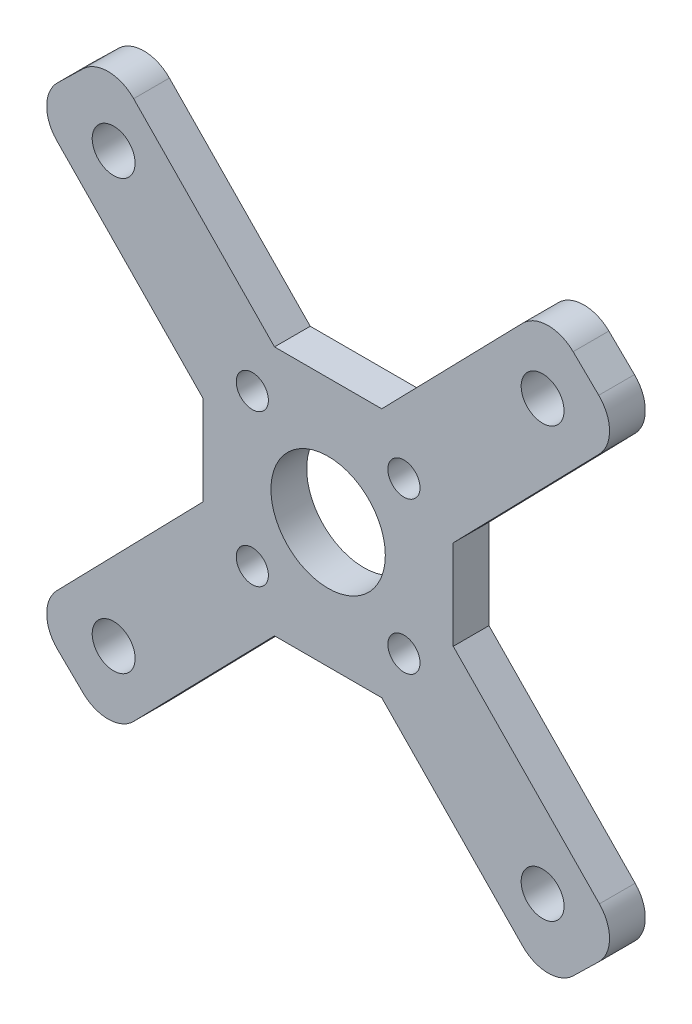
ISO-10303-21;
HEADER;
FILE_DESCRIPTION(('STEP AP214'),'2;1');
FILE_NAME('part.step','',(''),(''),'','','');
FILE_SCHEMA(('AUTOMOTIVE_DESIGN { 1 0 10303 214 1 1 1 1 }'));
ENDSEC;
DATA;
#1=APPLICATION_CONTEXT('core data for automotive mechanical design processes');
#2=APPLICATION_PROTOCOL_DEFINITION('international standard','automotive_design',2000,#1);
#3=PRODUCT_CONTEXT('',#1,'mechanical');
#4=PRODUCT('Part','Part','',(#3));
#5=PRODUCT_RELATED_PRODUCT_CATEGORY('part','',(#4));
#6=PRODUCT_DEFINITION_FORMATION('','',#4);
#7=PRODUCT_DEFINITION_CONTEXT('part definition',#1,'design');
#8=PRODUCT_DEFINITION('design','',#6,#7);
#9=PRODUCT_DEFINITION_SHAPE('','',#8);
#10=(LENGTH_UNIT() NAMED_UNIT(*) SI_UNIT(.MILLI.,.METRE.));
#11=(NAMED_UNIT(*) PLANE_ANGLE_UNIT() SI_UNIT($,.RADIAN.));
#12=(NAMED_UNIT(*) SI_UNIT($,.STERADIAN.) SOLID_ANGLE_UNIT());
#13=UNCERTAINTY_MEASURE_WITH_UNIT(LENGTH_MEASURE(1.E-05),#10,'distance_accuracy_value','');
#14=(GEOMETRIC_REPRESENTATION_CONTEXT(3) GLOBAL_UNCERTAINTY_ASSIGNED_CONTEXT((#13)) GLOBAL_UNIT_ASSIGNED_CONTEXT((#10,
#11,#12)) REPRESENTATION_CONTEXT('',''));
#15=CARTESIAN_POINT('',(0.,0.,0.));
#16=DIRECTION('',(0.,0.,1.));
#17=DIRECTION('',(1.,0.,0.));
#18=AXIS2_PLACEMENT_3D('',#15,#16,#17);
#19=CARTESIAN_POINT('',(17.5,-7.49999999999993,5.));
#20=DIRECTION('',(-1.,0.,0.));
#21=DIRECTION('',(0.,0.,1.));
#22=AXIS2_PLACEMENT_3D('',#19,#20,#21);
#23=PLANE('',#22);
#24=DIRECTION('',(0.,0.,1.));
#25=VECTOR('',#24,1.);
#26=CARTESIAN_POINT('',(17.5,-6.26916795088131,0.));
#27=LINE('',#26,#25);
#28=CARTESIAN_POINT('',(17.5,-6.26916795088131,0.));
#29=VERTEX_POINT('',#28);
#30=CARTESIAN_POINT('',(17.5,-6.26916795088131,5.));
#31=VERTEX_POINT('',#30);
#32=EDGE_CURVE('E329',#29,#31,#27,.T.);
#33=ORIENTED_EDGE('',*,*,#32,.F.);
#34=DIRECTION('',(0.,1.,0.));
#35=VECTOR('',#34,1.);
#36=CARTESIAN_POINT('',(17.5,-7.49999999999993,0.));
#37=LINE('',#36,#35);
#38=CARTESIAN_POINT('',(17.5,6.26916795088131,0.));
#39=VERTEX_POINT('',#38);
#40=EDGE_CURVE('E514',#29,#39,#37,.T.);
#41=ORIENTED_EDGE('',*,*,#40,.T.);
#42=DIRECTION('',(0.,0.,1.));
#43=VECTOR('',#42,1.);
#44=CARTESIAN_POINT('',(17.5,6.26916795088131,0.));
#45=LINE('',#44,#43);
#46=CARTESIAN_POINT('',(17.5,6.26916795088131,5.));
#47=VERTEX_POINT('',#46);
#48=EDGE_CURVE('E388',#39,#47,#45,.T.);
#49=ORIENTED_EDGE('',*,*,#48,.T.);
#50=DIRECTION('',(0.,1.,0.));
#51=VECTOR('',#50,1.);
#52=CARTESIAN_POINT('',(17.5,-7.49999999999993,5.));
#53=LINE('',#52,#51);
#54=EDGE_CURVE('E499',#31,#47,#53,.T.);
#55=ORIENTED_EDGE('',*,*,#54,.F.);
#56=EDGE_LOOP('',(#33,#41,#49,#55));
#57=FACE_BOUND('',#56,.T.);
#58=ADVANCED_FACE('F39',(#57),#23,.F.);
#59=CARTESIAN_POINT('',(-17.5,-7.49999999999994,5.));
#60=DIRECTION('',(1.,0.,0.));
#61=DIRECTION('',(0.,0.,-1.));
#62=AXIS2_PLACEMENT_3D('',#59,#60,#61);
#63=PLANE('',#62);
#64=DIRECTION('',(0.,-1.,0.));
#65=VECTOR('',#64,1.);
#66=CARTESIAN_POINT('',(-17.5,-7.49999999999994,0.));
#67=LINE('',#66,#65);
#68=CARTESIAN_POINT('',(-17.5,6.26916795088131,0.));
#69=VERTEX_POINT('',#68);
#70=CARTESIAN_POINT('',(-17.5,-6.26916795088133,0.));
#71=VERTEX_POINT('',#70);
#72=EDGE_CURVE('E500',#69,#71,#67,.T.);
#73=ORIENTED_EDGE('',*,*,#72,.T.);
#74=DIRECTION('',(0.,0.,1.));
#75=VECTOR('',#74,1.);
#76=CARTESIAN_POINT('',(-17.5,-6.26916795088133,0.));
#77=LINE('',#76,#75);
#78=CARTESIAN_POINT('',(-17.5,-6.26916795088133,5.));
#79=VERTEX_POINT('',#78);
#80=EDGE_CURVE('E270',#71,#79,#77,.T.);
#81=ORIENTED_EDGE('',*,*,#80,.T.);
#82=DIRECTION('',(0.,-1.,0.));
#83=VECTOR('',#82,1.);
#84=CARTESIAN_POINT('',(-17.5,-7.49999999999994,5.));
#85=LINE('',#84,#83);
#86=CARTESIAN_POINT('',(-17.5,6.26916795088131,5.));
#87=VERTEX_POINT('',#86);
#88=EDGE_CURVE('E507',#87,#79,#85,.T.);
#89=ORIENTED_EDGE('',*,*,#88,.F.);
#90=DIRECTION('',(0.,0.,1.));
#91=VECTOR('',#90,1.);
#92=CARTESIAN_POINT('',(-17.5,6.26916795088131,0.));
#93=LINE('',#92,#91);
#94=EDGE_CURVE('E449',#69,#87,#93,.T.);
#95=ORIENTED_EDGE('',*,*,#94,.F.);
#96=EDGE_LOOP('',(#73,#81,#89,#95));
#97=FACE_BOUND('',#96,.T.);
#98=ADVANCED_FACE('F564',(#97),#63,.F.);
#99=CARTESIAN_POINT('',(-7.50000000000001,-7.50000000000001,5.));
#100=DIRECTION('',(0.,0.,-1.));
#101=DIRECTION('',(-1.,0.,0.));
#102=AXIS2_PLACEMENT_3D('',#99,#100,#101);
#103=PLANE('',#102);
#104=ORIENTED_EDGE('',*,*,#88,.T.);
#105=DIRECTION('',(-0.697933742188362,-0.716162336006963,0.));
#106=VECTOR('',#105,1.);
#107=CARTESIAN_POINT('',(-5.84200619075185,5.69330867821478,5.));
#108=LINE('',#107,#106);
#109=CARTESIAN_POINT('',(-37.9445078227182,-27.2476442671602,5.));
#110=VERTEX_POINT('',#109);
#111=EDGE_CURVE('E257',#79,#110,#108,.T.);
#112=ORIENTED_EDGE('',*,*,#111,.T.);
#113=CARTESIAN_POINT('',(-34.3636961426834,-30.7373129781021,5.));
#114=DIRECTION('',(0.,0.,1.));
#115=DIRECTION('',(1.,0.,0.));
#116=AXIS2_PLACEMENT_3D('',#113,#114,#115);
#117=CIRCLE('',#116,4.99999999999997);
#118=CARTESIAN_POINT('',(-37.8533648536251,-34.3181246581368,5.));
#119=VERTEX_POINT('',#118);
#120=EDGE_CURVE('E233',#119,#110,#117,.F.);
#121=ORIENTED_EDGE('',*,*,#120,.F.);
#122=DIRECTION('',(0.716162336006962,-0.697933742188362,0.));
#123=VECTOR('',#122,1.);
#124=CARTESIAN_POINT('',(-35.5921703429081,-36.5217646254098,5.));
#125=LINE('',#124,#123);
#126=CARTESIAN_POINT('',(-34.2725531735903,-37.8077933690787,5.));
#127=VERTEX_POINT('',#126);
#128=EDGE_CURVE('E248',#119,#127,#125,.T.);
#129=ORIENTED_EDGE('',*,*,#128,.T.);
#130=CARTESIAN_POINT('',(-30.7828844626485,-34.2269816890439,5.));
#131=DIRECTION('',(0.,0.,1.));
#132=DIRECTION('',(1.,0.,0.));
#133=AXIS2_PLACEMENT_3D('',#130,#131,#132);
#134=CIRCLE('',#133,4.99999999999997);
#135=CARTESIAN_POINT('',(-27.2020727826137,-37.7166503999857,5.));
#136=VERTEX_POINT('',#135);
#137=EDGE_CURVE('E206',#127,#136,#134,.T.);
#138=ORIENTED_EDGE('',*,*,#137,.T.);
#139=DIRECTION('',(0.697933742188361,0.716162336006963,0.));
#140=VECTOR('',#139,1.);
#141=CARTESIAN_POINT('',(4.90042884935259,-4.77569745461063,5.));
#142=LINE('',#141,#140);
#143=CARTESIAN_POINT('',(-7.49999999999993,-17.5,5.));
#144=VERTEX_POINT('',#143);
#145=EDGE_CURVE('E253',#136,#144,#142,.T.);
#146=ORIENTED_EDGE('',*,*,#145,.T.);
#147=DIRECTION('',(1.,0.,0.));
#148=VECTOR('',#147,1.);
#149=CARTESIAN_POINT('',(7.49999999999993,-17.5,5.));
#150=LINE('',#149,#148);
#151=CARTESIAN_POINT('',(7.49999999999993,-17.5,5.));
#152=VERTEX_POINT('',#151);
#153=EDGE_CURVE('E495',#144,#152,#150,.T.);
#154=ORIENTED_EDGE('',*,*,#153,.T.);
#155=DIRECTION('',(-0.697933742188362,0.716162336006963,0.));
#156=VECTOR('',#155,1.);
#157=CARTESIAN_POINT('',(-4.90042884935259,-4.77569745461064,5.));
#158=LINE('',#157,#156);
#159=CARTESIAN_POINT('',(27.2020727826137,-37.7166503999857,5.));
#160=VERTEX_POINT('',#159);
#161=EDGE_CURVE('E304',#160,#152,#158,.T.);
#162=ORIENTED_EDGE('',*,*,#161,.F.);
#163=CARTESIAN_POINT('',(30.7828844626485,-34.2269816890439,5.));
#164=DIRECTION('',(0.,0.,1.));
#165=DIRECTION('',(1.,0.,0.));
#166=AXIS2_PLACEMENT_3D('',#163,#164,#165);
#167=CIRCLE('',#166,4.99999999999997);
#168=CARTESIAN_POINT('',(34.2725531735903,-37.8077933690787,5.));
#169=VERTEX_POINT('',#168);
#170=EDGE_CURVE('E307',#160,#169,#167,.T.);
#171=ORIENTED_EDGE('',*,*,#170,.T.);
#172=DIRECTION('',(-0.716162336006962,-0.697933742188362,0.));
#173=VECTOR('',#172,1.);
#174=CARTESIAN_POINT('',(35.5921703429081,-36.5217646254098,5.));
#175=LINE('',#174,#173);
#176=CARTESIAN_POINT('',(37.8533648536252,-34.3181246581368,5.));
#177=VERTEX_POINT('',#176);
#178=EDGE_CURVE('E311',#177,#169,#175,.T.);
#179=ORIENTED_EDGE('',*,*,#178,.F.);
#180=CARTESIAN_POINT('',(34.3636961426834,-30.737312978102,5.));
#181=DIRECTION('',(0.,0.,1.));
#182=DIRECTION('',(1.,0.,0.));
#183=AXIS2_PLACEMENT_3D('',#180,#181,#182);
#184=CIRCLE('',#183,4.99999999999997);
#185=CARTESIAN_POINT('',(37.9445078227182,-27.2476442671602,5.));
#186=VERTEX_POINT('',#185);
#187=EDGE_CURVE('E266',#186,#177,#184,.F.);
#188=ORIENTED_EDGE('',*,*,#187,.F.);
#189=DIRECTION('',(0.697933742188362,-0.716162336006963,0.));
#190=VECTOR('',#189,1.);
#191=CARTESIAN_POINT('',(5.84200619075185,5.69330867821479,5.));
#192=LINE('',#191,#190);
#193=EDGE_CURVE('E55',#31,#186,#192,.T.);
#194=ORIENTED_EDGE('',*,*,#193,.F.);
#195=ORIENTED_EDGE('',*,*,#54,.T.);
#196=DIRECTION('',(0.697933742188362,0.716162336006963,0.));
#197=VECTOR('',#196,1.);
#198=CARTESIAN_POINT('',(5.84200619075185,-5.69330867821479,5.));
#199=LINE('',#198,#197);
#200=CARTESIAN_POINT('',(37.9445078227182,27.2476442671602,5.));
#201=VERTEX_POINT('',#200);
#202=EDGE_CURVE('E374',#47,#201,#199,.T.);
#203=ORIENTED_EDGE('',*,*,#202,.T.);
#204=CARTESIAN_POINT('',(34.3636961426834,30.737312978102,5.));
#205=DIRECTION('',(0.,0.,1.));
#206=DIRECTION('',(1.,0.,0.));
#207=AXIS2_PLACEMENT_3D('',#204,#205,#206);
#208=CIRCLE('',#207,4.99999999999997);
#209=CARTESIAN_POINT('',(37.8533648536252,34.3181246581368,5.));
#210=VERTEX_POINT('',#209);
#211=EDGE_CURVE('E340',#210,#201,#208,.F.);
#212=ORIENTED_EDGE('',*,*,#211,.F.);
#213=DIRECTION('',(-0.716162336006962,0.697933742188362,0.));
#214=VECTOR('',#213,1.);
#215=CARTESIAN_POINT('',(35.5921703429081,36.5217646254098,5.));
#216=LINE('',#215,#214);
#217=CARTESIAN_POINT('',(34.2725531735903,37.8077933690787,5.));
#218=VERTEX_POINT('',#217);
#219=EDGE_CURVE('E362',#210,#218,#216,.T.);
#220=ORIENTED_EDGE('',*,*,#219,.T.);
#221=CARTESIAN_POINT('',(30.7828844626485,34.2269816890439,5.));
#222=DIRECTION('',(0.,0.,1.));
#223=DIRECTION('',(1.,0.,0.));
#224=AXIS2_PLACEMENT_3D('',#221,#222,#223);
#225=CIRCLE('',#224,4.99999999999997);
#226=CARTESIAN_POINT('',(27.2020727826137,37.7166503999857,5.));
#227=VERTEX_POINT('',#226);
#228=EDGE_CURVE('E366',#218,#227,#225,.T.);
#229=ORIENTED_EDGE('',*,*,#228,.T.);
#230=DIRECTION('',(-0.697933742188362,-0.716162336006963,0.));
#231=VECTOR('',#230,1.);
#232=CARTESIAN_POINT('',(-4.90042884935259,4.77569745461064,5.));
#233=LINE('',#232,#231);
#234=CARTESIAN_POINT('',(7.49999999999993,17.5,5.));
#235=VERTEX_POINT('',#234);
#236=EDGE_CURVE('E370',#227,#235,#233,.T.);
#237=ORIENTED_EDGE('',*,*,#236,.T.);
#238=DIRECTION('',(-1.,0.,0.));
#239=VECTOR('',#238,1.);
#240=CARTESIAN_POINT('',(7.49999999999993,17.5,5.));
#241=LINE('',#240,#239);
#242=CARTESIAN_POINT('',(-7.49999999999993,17.5,5.));
#243=VERTEX_POINT('',#242);
#244=EDGE_CURVE('E503',#235,#243,#241,.T.);
#245=ORIENTED_EDGE('',*,*,#244,.T.);
#246=DIRECTION('',(0.697933742188362,-0.716162336006963,0.));
#247=VECTOR('',#246,1.);
#248=CARTESIAN_POINT('',(4.90042884935259,4.77569745461064,5.));
#249=LINE('',#248,#247);
#250=CARTESIAN_POINT('',(-27.2020727826137,37.7166503999857,5.));
#251=VERTEX_POINT('',#250);
#252=EDGE_CURVE('E424',#251,#243,#249,.T.);
#253=ORIENTED_EDGE('',*,*,#252,.F.);
#254=CARTESIAN_POINT('',(-30.7828844626485,34.2269816890439,5.));
#255=DIRECTION('',(0.,0.,1.));
#256=DIRECTION('',(1.,0.,0.));
#257=AXIS2_PLACEMENT_3D('',#254,#255,#256);
#258=CIRCLE('',#257,4.99999999999997);
#259=CARTESIAN_POINT('',(-34.2725531735903,37.8077933690786,5.));
#260=VERTEX_POINT('',#259);
#261=EDGE_CURVE('E427',#260,#251,#258,.F.);
#262=ORIENTED_EDGE('',*,*,#261,.F.);
#263=DIRECTION('',(0.716162336006962,0.697933742188362,0.));
#264=VECTOR('',#263,1.);
#265=CARTESIAN_POINT('',(-35.5921703429081,36.5217646254098,5.));
#266=LINE('',#265,#264);
#267=CARTESIAN_POINT('',(-37.8533648536252,34.3181246581368,5.));
#268=VERTEX_POINT('',#267);
#269=EDGE_CURVE('E430',#268,#260,#266,.T.);
#270=ORIENTED_EDGE('',*,*,#269,.F.);
#271=CARTESIAN_POINT('',(-34.3636961426834,30.737312978102,5.));
#272=DIRECTION('',(0.,0.,1.));
#273=DIRECTION('',(1.,0.,0.));
#274=AXIS2_PLACEMENT_3D('',#271,#272,#273);
#275=CIRCLE('',#274,4.99999999999997);
#276=CARTESIAN_POINT('',(-37.9445078227182,27.2476442671602,5.));
#277=VERTEX_POINT('',#276);
#278=EDGE_CURVE('E384',#277,#268,#275,.F.);
#279=ORIENTED_EDGE('',*,*,#278,.F.);
#280=DIRECTION('',(-0.697933742188362,0.716162336006962,0.));
#281=VECTOR('',#280,1.);
#282=CARTESIAN_POINT('',(-5.84200619075185,-5.69330867821479,5.));
#283=LINE('',#282,#281);
#284=EDGE_CURVE('E62',#87,#277,#283,.T.);
#285=ORIENTED_EDGE('',*,*,#284,.F.);
#286=EDGE_LOOP('',(#104,#112,#121,#129,#138,#146,#154,#162,#171,#179,#188,#194,#195,#203,#212,
#220,#229,#237,#245,#253,#262,#270,#279,#285));
#287=FACE_BOUND('',#286,.T.);
#288=CARTESIAN_POINT('',(0.,0.,5.));
#289=DIRECTION('',(0.,0.,1.));
#290=DIRECTION('',(1.,0.,0.));
#291=AXIS2_PLACEMENT_3D('',#288,#289,#290);
#292=CIRCLE('',#291,8.);
#293=CARTESIAN_POINT('',(8.,0.,5.));
#294=VERTEX_POINT('',#293);
#295=EDGE_CURVE('E487',#294,#294,#292,.T.);
#296=ORIENTED_EDGE('',*,*,#295,.F.);
#297=EDGE_LOOP('',(#296));
#298=FACE_BOUND('',#297,.T.);
#299=CARTESIAN_POINT('',(-10.605,10.605,5.));
#300=DIRECTION('',(0.,0.,1.));
#301=DIRECTION('',(1.,0.,0.));
#302=AXIS2_PLACEMENT_3D('',#299,#300,#301);
#303=CIRCLE('',#302,2.25);
#304=CARTESIAN_POINT('',(-8.355,10.605,5.));
#305=VERTEX_POINT('',#304);
#306=EDGE_CURVE('E479',#305,#305,#303,.T.);
#307=ORIENTED_EDGE('',*,*,#306,.F.);
#308=EDGE_LOOP('',(#307));
#309=FACE_BOUND('',#308,.T.);
#310=CARTESIAN_POINT('',(10.605,10.605,5.));
#311=DIRECTION('',(0.,0.,1.));
#312=DIRECTION('',(1.,0.,0.));
#313=AXIS2_PLACEMENT_3D('',#310,#311,#312);
#314=CIRCLE('',#313,2.25000000000001);
#315=CARTESIAN_POINT('',(12.855,10.605,5.));
#316=VERTEX_POINT('',#315);
#317=EDGE_CURVE('E471',#316,#316,#314,.T.);
#318=ORIENTED_EDGE('',*,*,#317,.F.);
#319=EDGE_LOOP('',(#318));
#320=FACE_BOUND('',#319,.T.);
#321=CARTESIAN_POINT('',(-10.605,-10.605,5.));
#322=DIRECTION('',(0.,0.,1.));
#323=DIRECTION('',(1.,0.,0.));
#324=AXIS2_PLACEMENT_3D('',#321,#322,#323);
#325=CIRCLE('',#324,2.25000000000001);
#326=CARTESIAN_POINT('',(-8.35499999999999,-10.605,5.));
#327=VERTEX_POINT('',#326);
#328=EDGE_CURVE('E463',#327,#327,#325,.T.);
#329=ORIENTED_EDGE('',*,*,#328,.F.);
#330=EDGE_LOOP('',(#329));
#331=FACE_BOUND('',#330,.T.);
#332=CARTESIAN_POINT('',(10.605,-10.605,5.));
#333=DIRECTION('',(0.,0.,1.));
#334=DIRECTION('',(1.,0.,0.));
#335=AXIS2_PLACEMENT_3D('',#332,#333,#334);
#336=CIRCLE('',#335,2.25);
#337=CARTESIAN_POINT('',(12.855,-10.605,5.));
#338=VERTEX_POINT('',#337);
#339=EDGE_CURVE('E455',#338,#338,#336,.T.);
#340=ORIENTED_EDGE('',*,*,#339,.F.);
#341=EDGE_LOOP('',(#340));
#342=FACE_BOUND('',#341,.T.);
#343=CARTESIAN_POINT('',(-30.,30.,5.));
#344=DIRECTION('',(0.,0.,1.));
#345=DIRECTION('',(1.,0.,0.));
#346=AXIS2_PLACEMENT_3D('',#343,#344,#345);
#347=CIRCLE('',#346,3.);
#348=CARTESIAN_POINT('',(-27.,30.,5.));
#349=VERTEX_POINT('',#348);
#350=EDGE_CURVE('E402',#349,#349,#347,.T.);
#351=ORIENTED_EDGE('',*,*,#350,.F.);
#352=EDGE_LOOP('',(#351));
#353=FACE_BOUND('',#352,.T.);
#354=CARTESIAN_POINT('',(30.,30.,5.));
#355=DIRECTION('',(0.,0.,1.));
#356=DIRECTION('',(1.,0.,0.));
#357=AXIS2_PLACEMENT_3D('',#354,#355,#356);
#358=CIRCLE('',#357,3.);
#359=CARTESIAN_POINT('',(33.,30.,5.));
#360=VERTEX_POINT('',#359);
#361=EDGE_CURVE('E322',#360,#360,#358,.T.);
#362=ORIENTED_EDGE('',*,*,#361,.F.);
#363=EDGE_LOOP('',(#362));
#364=FACE_BOUND('',#363,.T.);
#365=CARTESIAN_POINT('',(30.,-30.,5.));
#366=DIRECTION('',(0.,0.,1.));
#367=DIRECTION('',(1.,0.,0.));
#368=AXIS2_PLACEMENT_3D('',#365,#366,#367);
#369=CIRCLE('',#368,3.);
#370=CARTESIAN_POINT('',(33.,-30.,5.));
#371=VERTEX_POINT('',#370);
#372=EDGE_CURVE('E281',#371,#371,#369,.T.);
#373=ORIENTED_EDGE('',*,*,#372,.F.);
#374=EDGE_LOOP('',(#373));
#375=FACE_BOUND('',#374,.T.);
#376=CARTESIAN_POINT('',(-30.,-30.,5.));
#377=DIRECTION('',(0.,0.,1.));
#378=DIRECTION('',(1.,0.,0.));
#379=AXIS2_PLACEMENT_3D('',#376,#377,#378);
#380=CIRCLE('',#379,3.);
#381=CARTESIAN_POINT('',(-27.,-30.,5.));
#382=VERTEX_POINT('',#381);
#383=EDGE_CURVE('E244',#382,#382,#380,.T.);
#384=ORIENTED_EDGE('',*,*,#383,.F.);
#385=EDGE_LOOP('',(#384));
#386=FACE_BOUND('',#385,.T.);
#387=ADVANCED_FACE('F544',(#287,#298,#309,#320,#331,#342,#353,#364,#375,#386),#103,.F.);
#388=CARTESIAN_POINT('',(-7.50000000000001,-7.50000000000001,0.));
#389=DIRECTION('',(0.,0.,-1.));
#390=DIRECTION('',(-1.,0.,0.));
#391=AXIS2_PLACEMENT_3D('',#388,#389,#390);
#392=PLANE('',#391);
#393=CARTESIAN_POINT('',(-10.605,-10.605,0.));
#394=DIRECTION('',(0.,0.,1.));
#395=DIRECTION('',(1.,0.,0.));
#396=AXIS2_PLACEMENT_3D('',#393,#394,#395);
#397=CIRCLE('',#396,2.25000000000001);
#398=CARTESIAN_POINT('',(-8.35499999999999,-10.605,0.));
#399=VERTEX_POINT('',#398);
#400=EDGE_CURVE('E459',#399,#399,#397,.T.);
#401=ORIENTED_EDGE('',*,*,#400,.T.);
#402=EDGE_LOOP('',(#401));
#403=FACE_BOUND('',#402,.T.);
#404=CARTESIAN_POINT('',(-10.605,10.605,0.));
#405=DIRECTION('',(0.,0.,1.));
#406=DIRECTION('',(1.,0.,0.));
#407=AXIS2_PLACEMENT_3D('',#404,#405,#406);
#408=CIRCLE('',#407,2.25);
#409=CARTESIAN_POINT('',(-8.355,10.605,0.));
#410=VERTEX_POINT('',#409);
#411=EDGE_CURVE('E475',#410,#410,#408,.T.);
#412=ORIENTED_EDGE('',*,*,#411,.T.);
#413=EDGE_LOOP('',(#412));
#414=FACE_BOUND('',#413,.T.);
#415=DIRECTION('',(1.,0.,0.));
#416=VECTOR('',#415,1.);
#417=CARTESIAN_POINT('',(7.49999999999993,-17.5,0.));
#418=LINE('',#417,#416);
#419=CARTESIAN_POINT('',(-7.49999999999993,-17.5,0.));
#420=VERTEX_POINT('',#419);
#421=CARTESIAN_POINT('',(7.49999999999993,-17.5,0.));
#422=VERTEX_POINT('',#421);
#423=EDGE_CURVE('E491',#420,#422,#418,.T.);
#424=ORIENTED_EDGE('',*,*,#423,.F.);
#425=DIRECTION('',(0.697933742188361,0.716162336006963,0.));
#426=VECTOR('',#425,1.);
#427=CARTESIAN_POINT('',(4.90042884935259,-4.77569745461063,0.));
#428=LINE('',#427,#426);
#429=CARTESIAN_POINT('',(-27.2020727826137,-37.7166503999857,0.));
#430=VERTEX_POINT('',#429);
#431=EDGE_CURVE('E222',#430,#420,#428,.T.);
#432=ORIENTED_EDGE('',*,*,#431,.F.);
#433=CARTESIAN_POINT('',(-30.7828844626485,-34.2269816890439,0.));
#434=DIRECTION('',(0.,0.,1.));
#435=DIRECTION('',(1.,0.,0.));
#436=AXIS2_PLACEMENT_3D('',#433,#434,#435);
#437=CIRCLE('',#436,4.99999999999997);
#438=CARTESIAN_POINT('',(-34.2725531735903,-37.8077933690787,0.));
#439=VERTEX_POINT('',#438);
#440=EDGE_CURVE('E204',#439,#430,#437,.T.);
#441=ORIENTED_EDGE('',*,*,#440,.F.);
#442=DIRECTION('',(0.716162336006962,-0.697933742188362,0.));
#443=VECTOR('',#442,1.);
#444=CARTESIAN_POINT('',(-35.5921703429081,-36.5217646254098,0.));
#445=LINE('',#444,#443);
#446=CARTESIAN_POINT('',(-37.8533648536251,-34.3181246581368,0.));
#447=VERTEX_POINT('',#446);
#448=EDGE_CURVE('E221',#447,#439,#445,.T.);
#449=ORIENTED_EDGE('',*,*,#448,.F.);
#450=CARTESIAN_POINT('',(-34.3636961426834,-30.7373129781021,0.));
#451=DIRECTION('',(0.,0.,1.));
#452=DIRECTION('',(1.,0.,0.));
#453=AXIS2_PLACEMENT_3D('',#450,#451,#452);
#454=CIRCLE('',#453,4.99999999999997);
#455=CARTESIAN_POINT('',(-37.9445078227182,-27.2476442671602,0.));
#456=VERTEX_POINT('',#455);
#457=EDGE_CURVE('E213',#447,#456,#454,.F.);
#458=ORIENTED_EDGE('',*,*,#457,.T.);
#459=DIRECTION('',(-0.697933742188362,-0.716162336006963,0.));
#460=VECTOR('',#459,1.);
#461=CARTESIAN_POINT('',(-5.84200619075185,5.69330867821478,0.));
#462=LINE('',#461,#460);
#463=EDGE_CURVE('E238',#71,#456,#462,.T.);
#464=ORIENTED_EDGE('',*,*,#463,.F.);
#465=ORIENTED_EDGE('',*,*,#72,.F.);
#466=DIRECTION('',(-0.697933742188362,0.716162336006962,0.));
#467=VECTOR('',#466,1.);
#468=CARTESIAN_POINT('',(-5.84200619075185,-5.69330867821479,0.));
#469=LINE('',#468,#467);
#470=CARTESIAN_POINT('',(-37.9445078227182,27.2476442671602,0.));
#471=VERTEX_POINT('',#470);
#472=EDGE_CURVE('E401',#69,#471,#469,.T.);
#473=ORIENTED_EDGE('',*,*,#472,.T.);
#474=CARTESIAN_POINT('',(-34.3636961426834,30.737312978102,0.));
#475=DIRECTION('',(0.,0.,1.));
#476=DIRECTION('',(1.,0.,0.));
#477=AXIS2_PLACEMENT_3D('',#474,#475,#476);
#478=CIRCLE('',#477,4.99999999999997);
#479=CARTESIAN_POINT('',(-37.8533648536252,34.3181246581368,0.));
#480=VERTEX_POINT('',#479);
#481=EDGE_CURVE('E397',#471,#480,#478,.F.);
#482=ORIENTED_EDGE('',*,*,#481,.T.);
#483=DIRECTION('',(0.716162336006962,0.697933742188362,0.));
#484=VECTOR('',#483,1.);
#485=CARTESIAN_POINT('',(-35.5921703429081,36.5217646254098,0.));
#486=LINE('',#485,#484);
#487=CARTESIAN_POINT('',(-34.2725531735903,37.8077933690786,0.));
#488=VERTEX_POINT('',#487);
#489=EDGE_CURVE('E411',#480,#488,#486,.T.);
#490=ORIENTED_EDGE('',*,*,#489,.T.);
#491=CARTESIAN_POINT('',(-30.7828844626485,34.2269816890439,0.));
#492=DIRECTION('',(0.,0.,1.));
#493=DIRECTION('',(1.,0.,0.));
#494=AXIS2_PLACEMENT_3D('',#491,#492,#493);
#495=CIRCLE('',#494,4.99999999999997);
#496=CARTESIAN_POINT('',(-27.2020727826137,37.7166503999857,0.));
#497=VERTEX_POINT('',#496);
#498=EDGE_CURVE('E408',#488,#497,#495,.F.);
#499=ORIENTED_EDGE('',*,*,#498,.T.);
#500=DIRECTION('',(0.697933742188362,-0.716162336006963,0.));
#501=VECTOR('',#500,1.);
#502=CARTESIAN_POINT('',(4.90042884935259,4.77569745461064,0.));
#503=LINE('',#502,#501);
#504=CARTESIAN_POINT('',(-7.49999999999993,17.5,0.));
#505=VERTEX_POINT('',#504);
#506=EDGE_CURVE('E405',#497,#505,#503,.T.);
#507=ORIENTED_EDGE('',*,*,#506,.T.);
#508=DIRECTION('',(-1.,0.,0.));
#509=VECTOR('',#508,1.);
#510=CARTESIAN_POINT('',(7.49999999999993,17.5,0.));
#511=LINE('',#510,#509);
#512=CARTESIAN_POINT('',(7.49999999999993,17.5,0.));
#513=VERTEX_POINT('',#512);
#514=EDGE_CURVE('E517',#513,#505,#511,.T.);
#515=ORIENTED_EDGE('',*,*,#514,.F.);
#516=DIRECTION('',(-0.697933742188362,-0.716162336006963,0.));
#517=VECTOR('',#516,1.);
#518=CARTESIAN_POINT('',(-4.90042884935259,4.77569745461064,0.));
#519=LINE('',#518,#517);
#520=CARTESIAN_POINT('',(27.2020727826137,37.7166503999857,0.));
#521=VERTEX_POINT('',#520);
#522=EDGE_CURVE('E348',#521,#513,#519,.T.);
#523=ORIENTED_EDGE('',*,*,#522,.F.);
#524=CARTESIAN_POINT('',(30.7828844626485,34.2269816890439,0.));
#525=DIRECTION('',(0.,0.,1.));
#526=DIRECTION('',(1.,0.,0.));
#527=AXIS2_PLACEMENT_3D('',#524,#525,#526);
#528=CIRCLE('',#527,4.99999999999997);
#529=CARTESIAN_POINT('',(34.2725531735903,37.8077933690787,0.));
#530=VERTEX_POINT('',#529);
#531=EDGE_CURVE('E344',#530,#521,#528,.T.);
#532=ORIENTED_EDGE('',*,*,#531,.F.);
#533=DIRECTION('',(-0.716162336006962,0.697933742188362,0.));
#534=VECTOR('',#533,1.);
#535=CARTESIAN_POINT('',(35.5921703429081,36.5217646254098,0.));
#536=LINE('',#535,#534);
#537=CARTESIAN_POINT('',(37.8533648536252,34.3181246581368,0.));
#538=VERTEX_POINT('',#537);
#539=EDGE_CURVE('E339',#538,#530,#536,.T.);
#540=ORIENTED_EDGE('',*,*,#539,.F.);
#541=CARTESIAN_POINT('',(34.3636961426834,30.737312978102,0.));
#542=DIRECTION('',(0.,0.,1.));
#543=DIRECTION('',(1.,0.,0.));
#544=AXIS2_PLACEMENT_3D('',#541,#542,#543);
#545=CIRCLE('',#544,4.99999999999997);
#546=CARTESIAN_POINT('',(37.9445078227182,27.2476442671602,0.));
#547=VERTEX_POINT('',#546);
#548=EDGE_CURVE('E355',#538,#547,#545,.F.);
#549=ORIENTED_EDGE('',*,*,#548,.T.);
#550=DIRECTION('',(0.697933742188362,0.716162336006963,0.));
#551=VECTOR('',#550,1.);
#552=CARTESIAN_POINT('',(5.84200619075185,-5.69330867821479,0.));
#553=LINE('',#552,#551);
#554=EDGE_CURVE('E351',#39,#547,#553,.T.);
#555=ORIENTED_EDGE('',*,*,#554,.F.);
#556=ORIENTED_EDGE('',*,*,#40,.F.);
#557=DIRECTION('',(0.697933742188362,-0.716162336006963,0.));
#558=VECTOR('',#557,1.);
#559=CARTESIAN_POINT('',(5.84200619075185,5.69330867821479,0.));
#560=LINE('',#559,#558);
#561=CARTESIAN_POINT('',(37.9445078227182,-27.2476442671602,0.));
#562=VERTEX_POINT('',#561);
#563=EDGE_CURVE('E280',#29,#562,#560,.T.);
#564=ORIENTED_EDGE('',*,*,#563,.T.);
#565=CARTESIAN_POINT('',(34.3636961426834,-30.737312978102,0.));
#566=DIRECTION('',(0.,0.,1.));
#567=DIRECTION('',(1.,0.,0.));
#568=AXIS2_PLACEMENT_3D('',#565,#566,#567);
#569=CIRCLE('',#568,4.99999999999997);
#570=CARTESIAN_POINT('',(37.8533648536252,-34.3181246581368,0.));
#571=VERTEX_POINT('',#570);
#572=EDGE_CURVE('E276',#562,#571,#569,.F.);
#573=ORIENTED_EDGE('',*,*,#572,.T.);
#574=DIRECTION('',(-0.716162336006962,-0.697933742188362,0.));
#575=VECTOR('',#574,1.);
#576=CARTESIAN_POINT('',(35.5921703429081,-36.5217646254098,0.));
#577=LINE('',#576,#575);
#578=CARTESIAN_POINT('',(34.2725531735903,-37.8077933690787,0.));
#579=VERTEX_POINT('',#578);
#580=EDGE_CURVE('E291',#571,#579,#577,.T.);
#581=ORIENTED_EDGE('',*,*,#580,.T.);
#582=CARTESIAN_POINT('',(30.7828844626485,-34.2269816890439,0.));
#583=DIRECTION('',(0.,0.,1.));
#584=DIRECTION('',(1.,0.,0.));
#585=AXIS2_PLACEMENT_3D('',#582,#583,#584);
#586=CIRCLE('',#585,4.99999999999997);
#587=CARTESIAN_POINT('',(27.2020727826137,-37.7166503999857,0.));
#588=VERTEX_POINT('',#587);
#589=EDGE_CURVE('E287',#588,#579,#586,.T.);
#590=ORIENTED_EDGE('',*,*,#589,.F.);
#591=DIRECTION('',(-0.697933742188362,0.716162336006963,0.));
#592=VECTOR('',#591,1.);
#593=CARTESIAN_POINT('',(-4.90042884935259,-4.77569745461064,0.));
#594=LINE('',#593,#592);
#595=EDGE_CURVE('E284',#588,#422,#594,.T.);
#596=ORIENTED_EDGE('',*,*,#595,.T.);
#597=EDGE_LOOP('',(#424,#432,#441,#449,#458,#464,#465,#473,#482,#490,#499,#507,#515,#523,#532,
#540,#549,#555,#556,#564,#573,#581,#590,#596));
#598=FACE_BOUND('',#597,.T.);
#599=CARTESIAN_POINT('',(0.,0.,0.));
#600=DIRECTION('',(0.,0.,1.));
#601=DIRECTION('',(1.,0.,0.));
#602=AXIS2_PLACEMENT_3D('',#599,#600,#601);
#603=CIRCLE('',#602,8.);
#604=CARTESIAN_POINT('',(8.,0.,0.));
#605=VERTEX_POINT('',#604);
#606=EDGE_CURVE('E483',#605,#605,#603,.T.);
#607=ORIENTED_EDGE('',*,*,#606,.T.);
#608=EDGE_LOOP('',(#607));
#609=FACE_BOUND('',#608,.T.);
#610=CARTESIAN_POINT('',(10.605,10.605,0.));
#611=DIRECTION('',(0.,0.,1.));
#612=DIRECTION('',(1.,0.,0.));
#613=AXIS2_PLACEMENT_3D('',#610,#611,#612);
#614=CIRCLE('',#613,2.25000000000001);
#615=CARTESIAN_POINT('',(12.855,10.605,0.));
#616=VERTEX_POINT('',#615);
#617=EDGE_CURVE('E467',#616,#616,#614,.T.);
#618=ORIENTED_EDGE('',*,*,#617,.T.);
#619=EDGE_LOOP('',(#618));
#620=FACE_BOUND('',#619,.T.);
#621=CARTESIAN_POINT('',(10.605,-10.605,0.));
#622=DIRECTION('',(0.,0.,1.));
#623=DIRECTION('',(1.,0.,0.));
#624=AXIS2_PLACEMENT_3D('',#621,#622,#623);
#625=CIRCLE('',#624,2.25);
#626=CARTESIAN_POINT('',(12.855,-10.605,0.));
#627=VERTEX_POINT('',#626);
#628=EDGE_CURVE('E440',#627,#627,#625,.T.);
#629=ORIENTED_EDGE('',*,*,#628,.T.);
#630=EDGE_LOOP('',(#629));
#631=FACE_BOUND('',#630,.T.);
#632=CARTESIAN_POINT('',(-30.,30.,0.));
#633=DIRECTION('',(0.,0.,1.));
#634=DIRECTION('',(1.,0.,0.));
#635=AXIS2_PLACEMENT_3D('',#632,#633,#634);
#636=CIRCLE('',#635,3.);
#637=CARTESIAN_POINT('',(-27.,30.,0.));
#638=VERTEX_POINT('',#637);
#639=EDGE_CURVE('E414',#638,#638,#636,.T.);
#640=ORIENTED_EDGE('',*,*,#639,.T.);
#641=EDGE_LOOP('',(#640));
#642=FACE_BOUND('',#641,.T.);
#643=CARTESIAN_POINT('',(30.,30.,0.));
#644=DIRECTION('',(0.,0.,1.));
#645=DIRECTION('',(1.,0.,0.));
#646=AXIS2_PLACEMENT_3D('',#643,#644,#645);
#647=CIRCLE('',#646,3.);
#648=CARTESIAN_POINT('',(33.,30.,0.));
#649=VERTEX_POINT('',#648);
#650=EDGE_CURVE('E335',#649,#649,#647,.T.);
#651=ORIENTED_EDGE('',*,*,#650,.T.);
#652=EDGE_LOOP('',(#651));
#653=FACE_BOUND('',#652,.T.);
#654=CARTESIAN_POINT('',(30.,-30.,0.));
#655=DIRECTION('',(0.,0.,1.));
#656=DIRECTION('',(1.,0.,0.));
#657=AXIS2_PLACEMENT_3D('',#654,#655,#656);
#658=CIRCLE('',#657,3.);
#659=CARTESIAN_POINT('',(33.,-30.,0.));
#660=VERTEX_POINT('',#659);
#661=EDGE_CURVE('E294',#660,#660,#658,.T.);
#662=ORIENTED_EDGE('',*,*,#661,.T.);
#663=EDGE_LOOP('',(#662));
#664=FACE_BOUND('',#663,.T.);
#665=CARTESIAN_POINT('',(-30.,-30.,0.));
#666=DIRECTION('',(0.,0.,1.));
#667=DIRECTION('',(1.,0.,0.));
#668=AXIS2_PLACEMENT_3D('',#665,#666,#667);
#669=CIRCLE('',#668,3.);
#670=CARTESIAN_POINT('',(-27.,-30.,0.));
#671=VERTEX_POINT('',#670);
#672=EDGE_CURVE('E229',#671,#671,#669,.T.);
#673=ORIENTED_EDGE('',*,*,#672,.T.);
#674=EDGE_LOOP('',(#673));
#675=FACE_BOUND('',#674,.T.);
#676=ADVANCED_FACE('F219',(#403,#414,#598,#609,#620,#631,#642,#653,#664,#675),#392,.T.);
#677=CARTESIAN_POINT('',(7.49999999999993,-17.5,5.));
#678=DIRECTION('',(0.,1.,0.));
#679=DIRECTION('',(-1.,0.,0.));
#680=AXIS2_PLACEMENT_3D('',#677,#678,#679);
#681=PLANE('',#680);
#682=ORIENTED_EDGE('',*,*,#423,.T.);
#683=DIRECTION('',(0.,0.,-1.));
#684=VECTOR('',#683,1.);
#685=CARTESIAN_POINT('',(7.49999999999993,-17.5,5.));
#686=LINE('',#685,#684);
#687=EDGE_CURVE('E48',#152,#422,#686,.T.);
#688=ORIENTED_EDGE('',*,*,#687,.F.);
#689=ORIENTED_EDGE('',*,*,#153,.F.);
#690=DIRECTION('',(0.,0.,-1.));
#691=VECTOR('',#690,1.);
#692=CARTESIAN_POINT('',(-7.49999999999993,-17.5,5.));
#693=LINE('',#692,#691);
#694=EDGE_CURVE('E11',#144,#420,#693,.T.);
#695=ORIENTED_EDGE('',*,*,#694,.T.);
#696=EDGE_LOOP('',(#682,#688,#689,#695));
#697=FACE_BOUND('',#696,.T.);
#698=ADVANCED_FACE('F41',(#697),#681,.F.);
#699=CARTESIAN_POINT('',(7.49999999999993,17.5,5.));
#700=DIRECTION('',(0.,-1.,0.));
#701=DIRECTION('',(1.,0.,0.));
#702=AXIS2_PLACEMENT_3D('',#699,#700,#701);
#703=PLANE('',#702);
#704=ORIENTED_EDGE('',*,*,#514,.T.);
#705=DIRECTION('',(0.,0.,-1.));
#706=VECTOR('',#705,1.);
#707=CARTESIAN_POINT('',(-7.49999999999994,17.5,5.));
#708=LINE('',#707,#706);
#709=EDGE_CURVE('E510',#243,#505,#708,.T.);
#710=ORIENTED_EDGE('',*,*,#709,.F.);
#711=ORIENTED_EDGE('',*,*,#244,.F.);
#712=DIRECTION('',(0.,0.,-1.));
#713=VECTOR('',#712,1.);
#714=CARTESIAN_POINT('',(7.49999999999993,17.5,5.));
#715=LINE('',#714,#713);
#716=EDGE_CURVE('E527',#235,#513,#715,.T.);
#717=ORIENTED_EDGE('',*,*,#716,.T.);
#718=EDGE_LOOP('',(#704,#710,#711,#717));
#719=FACE_BOUND('',#718,.T.);
#720=ADVANCED_FACE('F573',(#719),#703,.F.);
#721=CARTESIAN_POINT('',(0.,0.,5.));
#722=DIRECTION('',(0.,0.,-1.));
#723=DIRECTION('',(-1.,0.,0.));
#724=AXIS2_PLACEMENT_3D('',#721,#722,#723);
#725=CYLINDRICAL_SURFACE('',#724,8.);
#726=ORIENTED_EDGE('',*,*,#295,.T.);
#727=EDGE_LOOP('',(#726));
#728=FACE_BOUND('',#727,.T.);
#729=ORIENTED_EDGE('',*,*,#606,.F.);
#730=EDGE_LOOP('',(#729));
#731=FACE_BOUND('',#730,.T.);
#732=ADVANCED_FACE('F575',(#728,#731),#725,.F.);
#733=CARTESIAN_POINT('',(-10.605,10.605,5.));
#734=DIRECTION('',(0.,0.,-1.));
#735=DIRECTION('',(-1.,0.,0.));
#736=AXIS2_PLACEMENT_3D('',#733,#734,#735);
#737=CYLINDRICAL_SURFACE('',#736,2.25);
#738=ORIENTED_EDGE('',*,*,#306,.T.);
#739=EDGE_LOOP('',(#738));
#740=FACE_BOUND('',#739,.T.);
#741=ORIENTED_EDGE('',*,*,#411,.F.);
#742=EDGE_LOOP('',(#741));
#743=FACE_BOUND('',#742,.T.);
#744=ADVANCED_FACE('F585',(#740,#743),#737,.F.);
#745=CARTESIAN_POINT('',(10.605,10.605,5.));
#746=DIRECTION('',(0.,0.,-1.));
#747=DIRECTION('',(-1.,0.,0.));
#748=AXIS2_PLACEMENT_3D('',#745,#746,#747);
#749=CYLINDRICAL_SURFACE('',#748,2.25000000000001);
#750=ORIENTED_EDGE('',*,*,#317,.T.);
#751=EDGE_LOOP('',(#750));
#752=FACE_BOUND('',#751,.T.);
#753=ORIENTED_EDGE('',*,*,#617,.F.);
#754=EDGE_LOOP('',(#753));
#755=FACE_BOUND('',#754,.T.);
#756=ADVANCED_FACE('F589',(#752,#755),#749,.F.);
#757=CARTESIAN_POINT('',(-10.605,-10.605,5.));
#758=DIRECTION('',(0.,0.,-1.));
#759=DIRECTION('',(-1.,0.,0.));
#760=AXIS2_PLACEMENT_3D('',#757,#758,#759);
#761=CYLINDRICAL_SURFACE('',#760,2.25000000000001);
#762=ORIENTED_EDGE('',*,*,#328,.T.);
#763=EDGE_LOOP('',(#762));
#764=FACE_BOUND('',#763,.T.);
#765=ORIENTED_EDGE('',*,*,#400,.F.);
#766=EDGE_LOOP('',(#765));
#767=FACE_BOUND('',#766,.T.);
#768=ADVANCED_FACE('F593',(#764,#767),#761,.F.);
#769=CARTESIAN_POINT('',(10.605,-10.605,5.));
#770=DIRECTION('',(0.,0.,-1.));
#771=DIRECTION('',(-1.,0.,0.));
#772=AXIS2_PLACEMENT_3D('',#769,#770,#771);
#773=CYLINDRICAL_SURFACE('',#772,2.25);
#774=ORIENTED_EDGE('',*,*,#339,.T.);
#775=EDGE_LOOP('',(#774));
#776=FACE_BOUND('',#775,.T.);
#777=ORIENTED_EDGE('',*,*,#628,.F.);
#778=EDGE_LOOP('',(#777));
#779=FACE_BOUND('',#778,.T.);
#780=ADVANCED_FACE('F597',(#776,#779),#773,.F.);
#781=CARTESIAN_POINT('',(-34.3636961426834,30.737312978102,0.));
#782=DIRECTION('',(0.,0.,1.));
#783=DIRECTION('',(1.,0.,0.));
#784=AXIS2_PLACEMENT_3D('',#781,#782,#783);
#785=CYLINDRICAL_SURFACE('',#784,4.99999999999997);
#786=ORIENTED_EDGE('',*,*,#278,.T.);
#787=DIRECTION('',(0.,0.,1.));
#788=VECTOR('',#787,1.);
#789=CARTESIAN_POINT('',(-37.8533648536252,34.3181246581368,0.));
#790=LINE('',#789,#788);
#791=EDGE_CURVE('E436',#480,#268,#790,.T.);
#792=ORIENTED_EDGE('',*,*,#791,.F.);
#793=ORIENTED_EDGE('',*,*,#481,.F.);
#794=DIRECTION('',(0.,0.,1.));
#795=VECTOR('',#794,1.);
#796=CARTESIAN_POINT('',(-37.9445078227182,27.2476442671602,0.));
#797=LINE('',#796,#795);
#798=EDGE_CURVE('E418',#471,#277,#797,.T.);
#799=ORIENTED_EDGE('',*,*,#798,.T.);
#800=EDGE_LOOP('',(#786,#792,#793,#799));
#801=FACE_BOUND('',#800,.T.);
#802=ADVANCED_FACE('F601',(#801),#785,.T.);
#803=CARTESIAN_POINT('',(-35.5921703429081,36.5217646254098,0.));
#804=DIRECTION('',(0.697933742188362,-0.716162336006962,0.));
#805=DIRECTION('',(0.716162336006962,0.697933742188362,0.));
#806=AXIS2_PLACEMENT_3D('',#803,#804,#805);
#807=PLANE('',#806);
#808=ORIENTED_EDGE('',*,*,#269,.T.);
#809=DIRECTION('',(0.,0.,1.));
#810=VECTOR('',#809,1.);
#811=CARTESIAN_POINT('',(-34.2725531735903,37.8077933690786,0.));
#812=LINE('',#811,#810);
#813=EDGE_CURVE('E441',#488,#260,#812,.T.);
#814=ORIENTED_EDGE('',*,*,#813,.F.);
#815=ORIENTED_EDGE('',*,*,#489,.F.);
#816=ORIENTED_EDGE('',*,*,#791,.T.);
#817=EDGE_LOOP('',(#808,#814,#815,#816));
#818=FACE_BOUND('',#817,.T.);
#819=ADVANCED_FACE('F605',(#818),#807,.F.);
#820=CARTESIAN_POINT('',(-30.7828844626485,34.2269816890439,0.));
#821=DIRECTION('',(0.,0.,1.));
#822=DIRECTION('',(1.,0.,0.));
#823=AXIS2_PLACEMENT_3D('',#820,#821,#822);
#824=CYLINDRICAL_SURFACE('',#823,4.99999999999997);
#825=ORIENTED_EDGE('',*,*,#261,.T.);
#826=DIRECTION('',(0.,0.,1.));
#827=VECTOR('',#826,1.);
#828=CARTESIAN_POINT('',(-27.2020727826137,37.7166503999857,0.));
#829=LINE('',#828,#827);
#830=EDGE_CURVE('E445',#497,#251,#829,.T.);
#831=ORIENTED_EDGE('',*,*,#830,.F.);
#832=ORIENTED_EDGE('',*,*,#498,.F.);
#833=ORIENTED_EDGE('',*,*,#813,.T.);
#834=EDGE_LOOP('',(#825,#831,#832,#833));
#835=FACE_BOUND('',#834,.T.);
#836=ADVANCED_FACE('F615',(#835),#824,.T.);
#837=CARTESIAN_POINT('',(4.90042884935259,4.77569745461064,0.));
#838=DIRECTION('',(-0.716162336006963,-0.697933742188362,0.));
#839=DIRECTION('',(0.697933742188362,-0.716162336006963,0.));
#840=AXIS2_PLACEMENT_3D('',#837,#838,#839);
#841=PLANE('',#840);
#842=ORIENTED_EDGE('',*,*,#252,.T.);
#843=ORIENTED_EDGE('',*,*,#709,.T.);
#844=ORIENTED_EDGE('',*,*,#506,.F.);
#845=ORIENTED_EDGE('',*,*,#830,.T.);
#846=EDGE_LOOP('',(#842,#843,#844,#845));
#847=FACE_BOUND('',#846,.T.);
#848=ADVANCED_FACE('F611',(#847),#841,.F.);
#849=CARTESIAN_POINT('',(-5.84200619075185,-5.69330867821479,0.));
#850=DIRECTION('',(0.716162336006962,0.697933742188362,0.));
#851=DIRECTION('',(-0.697933742188362,0.716162336006962,0.));
#852=AXIS2_PLACEMENT_3D('',#849,#850,#851);
#853=PLANE('',#852);
#854=ORIENTED_EDGE('',*,*,#284,.T.);
#855=ORIENTED_EDGE('',*,*,#798,.F.);
#856=ORIENTED_EDGE('',*,*,#472,.F.);
#857=ORIENTED_EDGE('',*,*,#94,.T.);
#858=EDGE_LOOP('',(#854,#855,#856,#857));
#859=FACE_BOUND('',#858,.T.);
#860=ADVANCED_FACE('F607',(#859),#853,.F.);
#861=CARTESIAN_POINT('',(-30.,30.,0.));
#862=DIRECTION('',(0.,0.,1.));
#863=DIRECTION('',(1.,0.,0.));
#864=AXIS2_PLACEMENT_3D('',#861,#862,#863);
#865=CYLINDRICAL_SURFACE('',#864,3.);
#866=ORIENTED_EDGE('',*,*,#639,.F.);
#867=EDGE_LOOP('',(#866));
#868=FACE_BOUND('',#867,.T.);
#869=ORIENTED_EDGE('',*,*,#350,.T.);
#870=EDGE_LOOP('',(#869));
#871=FACE_BOUND('',#870,.T.);
#872=ADVANCED_FACE('F610',(#868,#871),#865,.F.);
#873=CARTESIAN_POINT('',(35.5921703429081,36.5217646254098,0.));
#874=DIRECTION('',(0.697933742188362,0.716162336006962,0.));
#875=DIRECTION('',(-0.716162336006962,0.697933742188362,0.));
#876=AXIS2_PLACEMENT_3D('',#873,#874,#875);
#877=PLANE('',#876);
#878=ORIENTED_EDGE('',*,*,#219,.F.);
#879=DIRECTION('',(0.,0.,1.));
#880=VECTOR('',#879,1.);
#881=CARTESIAN_POINT('',(37.8533648536252,34.3181246581368,0.));
#882=LINE('',#881,#880);
#883=EDGE_CURVE('E381',#538,#210,#882,.T.);
#884=ORIENTED_EDGE('',*,*,#883,.F.);
#885=ORIENTED_EDGE('',*,*,#539,.T.);
#886=DIRECTION('',(0.,0.,1.));
#887=VECTOR('',#886,1.);
#888=CARTESIAN_POINT('',(34.2725531735903,37.8077933690787,0.));
#889=LINE('',#888,#887);
#890=EDGE_CURVE('E358',#530,#218,#889,.T.);
#891=ORIENTED_EDGE('',*,*,#890,.T.);
#892=EDGE_LOOP('',(#878,#884,#885,#891));
#893=FACE_BOUND('',#892,.T.);
#894=ADVANCED_FACE('F625',(#893),#877,.T.);
#895=CARTESIAN_POINT('',(34.3636961426834,30.737312978102,0.));
#896=DIRECTION('',(0.,0.,1.));
#897=DIRECTION('',(1.,0.,0.));
#898=AXIS2_PLACEMENT_3D('',#895,#896,#897);
#899=CYLINDRICAL_SURFACE('',#898,4.99999999999997);
#900=ORIENTED_EDGE('',*,*,#211,.T.);
#901=DIRECTION('',(0.,0.,1.));
#902=VECTOR('',#901,1.);
#903=CARTESIAN_POINT('',(37.9445078227182,27.2476442671602,0.));
#904=LINE('',#903,#902);
#905=EDGE_CURVE('E385',#547,#201,#904,.T.);
#906=ORIENTED_EDGE('',*,*,#905,.F.);
#907=ORIENTED_EDGE('',*,*,#548,.F.);
#908=ORIENTED_EDGE('',*,*,#883,.T.);
#909=EDGE_LOOP('',(#900,#906,#907,#908));
#910=FACE_BOUND('',#909,.T.);
#911=ADVANCED_FACE('F635',(#910),#899,.T.);
#912=CARTESIAN_POINT('',(5.84200619075185,-5.69330867821479,0.));
#913=DIRECTION('',(0.716162336006963,-0.697933742188362,0.));
#914=DIRECTION('',(0.697933742188362,0.716162336006963,0.));
#915=AXIS2_PLACEMENT_3D('',#912,#913,#914);
#916=PLANE('',#915);
#917=ORIENTED_EDGE('',*,*,#202,.F.);
#918=ORIENTED_EDGE('',*,*,#48,.F.);
#919=ORIENTED_EDGE('',*,*,#554,.T.);
#920=ORIENTED_EDGE('',*,*,#905,.T.);
#921=EDGE_LOOP('',(#917,#918,#919,#920));
#922=FACE_BOUND('',#921,.T.);
#923=ADVANCED_FACE('F643',(#922),#916,.T.);
#924=CARTESIAN_POINT('',(-4.90042884935259,4.77569745461064,0.));
#925=DIRECTION('',(-0.716162336006963,0.697933742188362,0.));
#926=DIRECTION('',(-0.697933742188362,-0.716162336006963,0.));
#927=AXIS2_PLACEMENT_3D('',#924,#925,#926);
#928=PLANE('',#927);
#929=ORIENTED_EDGE('',*,*,#236,.F.);
#930=DIRECTION('',(0.,0.,1.));
#931=VECTOR('',#930,1.);
#932=CARTESIAN_POINT('',(27.2020727826137,37.7166503999857,0.));
#933=LINE('',#932,#931);
#934=EDGE_CURVE('E392',#521,#227,#933,.T.);
#935=ORIENTED_EDGE('',*,*,#934,.F.);
#936=ORIENTED_EDGE('',*,*,#522,.T.);
#937=ORIENTED_EDGE('',*,*,#716,.F.);
#938=EDGE_LOOP('',(#929,#935,#936,#937));
#939=FACE_BOUND('',#938,.T.);
#940=ADVANCED_FACE('F631',(#939),#928,.T.);
#941=CARTESIAN_POINT('',(30.,30.,0.));
#942=DIRECTION('',(0.,0.,1.));
#943=DIRECTION('',(1.,0.,0.));
#944=AXIS2_PLACEMENT_3D('',#941,#942,#943);
#945=CYLINDRICAL_SURFACE('',#944,3.);
#946=ORIENTED_EDGE('',*,*,#650,.F.);
#947=EDGE_LOOP('',(#946));
#948=FACE_BOUND('',#947,.T.);
#949=ORIENTED_EDGE('',*,*,#361,.T.);
#950=EDGE_LOOP('',(#949));
#951=FACE_BOUND('',#950,.T.);
#952=ADVANCED_FACE('F627',(#948,#951),#945,.F.);
#953=CARTESIAN_POINT('',(30.7828844626485,34.2269816890439,0.));
#954=DIRECTION('',(0.,0.,1.));
#955=DIRECTION('',(1.,0.,0.));
#956=AXIS2_PLACEMENT_3D('',#953,#954,#955);
#957=CYLINDRICAL_SURFACE('',#956,4.99999999999997);
#958=ORIENTED_EDGE('',*,*,#228,.F.);
#959=ORIENTED_EDGE('',*,*,#890,.F.);
#960=ORIENTED_EDGE('',*,*,#531,.T.);
#961=ORIENTED_EDGE('',*,*,#934,.T.);
#962=EDGE_LOOP('',(#958,#959,#960,#961));
#963=FACE_BOUND('',#962,.T.);
#964=ADVANCED_FACE('F630',(#963),#957,.T.);
#965=CARTESIAN_POINT('',(34.3636961426834,-30.737312978102,0.));
#966=DIRECTION('',(0.,0.,1.));
#967=DIRECTION('',(1.,0.,0.));
#968=AXIS2_PLACEMENT_3D('',#965,#966,#967);
#969=CYLINDRICAL_SURFACE('',#968,4.99999999999997);
#970=ORIENTED_EDGE('',*,*,#187,.T.);
#971=DIRECTION('',(0.,0.,1.));
#972=VECTOR('',#971,1.);
#973=CARTESIAN_POINT('',(37.8533648536252,-34.3181246581368,0.));
#974=LINE('',#973,#972);
#975=EDGE_CURVE('E318',#571,#177,#974,.T.);
#976=ORIENTED_EDGE('',*,*,#975,.F.);
#977=ORIENTED_EDGE('',*,*,#572,.F.);
#978=DIRECTION('',(0.,0.,1.));
#979=VECTOR('',#978,1.);
#980=CARTESIAN_POINT('',(37.9445078227182,-27.2476442671602,0.));
#981=LINE('',#980,#979);
#982=EDGE_CURVE('E298',#562,#186,#981,.T.);
#983=ORIENTED_EDGE('',*,*,#982,.T.);
#984=EDGE_LOOP('',(#970,#976,#977,#983));
#985=FACE_BOUND('',#984,.T.);
#986=ADVANCED_FACE('F639',(#985),#969,.T.);
#987=CARTESIAN_POINT('',(35.5921703429081,-36.5217646254098,0.));
#988=DIRECTION('',(-0.697933742188362,0.716162336006962,0.));
#989=DIRECTION('',(-0.716162336006962,-0.697933742188362,0.));
#990=AXIS2_PLACEMENT_3D('',#987,#988,#989);
#991=PLANE('',#990);
#992=ORIENTED_EDGE('',*,*,#178,.T.);
#993=DIRECTION('',(0.,0.,1.));
#994=VECTOR('',#993,1.);
#995=CARTESIAN_POINT('',(34.2725531735903,-37.8077933690787,0.));
#996=LINE('',#995,#994);
#997=EDGE_CURVE('E323',#579,#169,#996,.T.);
#998=ORIENTED_EDGE('',*,*,#997,.F.);
#999=ORIENTED_EDGE('',*,*,#580,.F.);
#1000=ORIENTED_EDGE('',*,*,#975,.T.);
#1001=EDGE_LOOP('',(#992,#998,#999,#1000));
#1002=FACE_BOUND('',#1001,.T.);
#1003=ADVANCED_FACE('F653',(#1002),#991,.F.);
#1004=CARTESIAN_POINT('',(30.7828844626485,-34.2269816890439,0.));
#1005=DIRECTION('',(0.,0.,1.));
#1006=DIRECTION('',(1.,0.,0.));
#1007=AXIS2_PLACEMENT_3D('',#1004,#1005,#1006);
#1008=CYLINDRICAL_SURFACE('',#1007,4.99999999999997);
#1009=ORIENTED_EDGE('',*,*,#170,.F.);
#1010=DIRECTION('',(0.,0.,1.));
#1011=VECTOR('',#1010,1.);
#1012=CARTESIAN_POINT('',(27.2020727826137,-37.7166503999857,0.));
#1013=LINE('',#1012,#1011);
#1014=EDGE_CURVE('E326',#588,#160,#1013,.T.);
#1015=ORIENTED_EDGE('',*,*,#1014,.F.);
#1016=ORIENTED_EDGE('',*,*,#589,.T.);
#1017=ORIENTED_EDGE('',*,*,#997,.T.);
#1018=EDGE_LOOP('',(#1009,#1015,#1016,#1017));
#1019=FACE_BOUND('',#1018,.T.);
#1020=ADVANCED_FACE('F543',(#1019),#1008,.T.);
#1021=CARTESIAN_POINT('',(-4.90042884935259,-4.77569745461064,0.));
#1022=DIRECTION('',(0.716162336006963,0.697933742188362,0.));
#1023=DIRECTION('',(-0.697933742188362,0.716162336006963,0.));
#1024=AXIS2_PLACEMENT_3D('',#1021,#1022,#1023);
#1025=PLANE('',#1024);
#1026=ORIENTED_EDGE('',*,*,#161,.T.);
#1027=ORIENTED_EDGE('',*,*,#687,.T.);
#1028=ORIENTED_EDGE('',*,*,#595,.F.);
#1029=ORIENTED_EDGE('',*,*,#1014,.T.);
#1030=EDGE_LOOP('',(#1026,#1027,#1028,#1029));
#1031=FACE_BOUND('',#1030,.T.);
#1032=ADVANCED_FACE('F535',(#1031),#1025,.F.);
#1033=CARTESIAN_POINT('',(5.84200619075185,5.69330867821479,0.));
#1034=DIRECTION('',(-0.716162336006963,-0.697933742188362,0.));
#1035=DIRECTION('',(0.697933742188362,-0.716162336006963,0.));
#1036=AXIS2_PLACEMENT_3D('',#1033,#1034,#1035);
#1037=PLANE('',#1036);
#1038=ORIENTED_EDGE('',*,*,#193,.T.);
#1039=ORIENTED_EDGE('',*,*,#982,.F.);
#1040=ORIENTED_EDGE('',*,*,#563,.F.);
#1041=ORIENTED_EDGE('',*,*,#32,.T.);
#1042=EDGE_LOOP('',(#1038,#1039,#1040,#1041));
#1043=FACE_BOUND('',#1042,.T.);
#1044=ADVANCED_FACE('F655',(#1043),#1037,.F.);
#1045=CARTESIAN_POINT('',(30.,-30.,0.));
#1046=DIRECTION('',(0.,0.,1.));
#1047=DIRECTION('',(1.,0.,0.));
#1048=AXIS2_PLACEMENT_3D('',#1045,#1046,#1047);
#1049=CYLINDRICAL_SURFACE('',#1048,3.);
#1050=ORIENTED_EDGE('',*,*,#661,.F.);
#1051=EDGE_LOOP('',(#1050));
#1052=FACE_BOUND('',#1051,.T.);
#1053=ORIENTED_EDGE('',*,*,#372,.T.);
#1054=EDGE_LOOP('',(#1053));
#1055=FACE_BOUND('',#1054,.T.);
#1056=ADVANCED_FACE('F658',(#1052,#1055),#1049,.F.);
#1057=CARTESIAN_POINT('',(-35.5921703429081,-36.5217646254098,0.));
#1058=DIRECTION('',(-0.697933742188362,-0.716162336006962,0.));
#1059=DIRECTION('',(0.716162336006962,-0.697933742188362,0.));
#1060=AXIS2_PLACEMENT_3D('',#1057,#1058,#1059);
#1061=PLANE('',#1060);
#1062=ORIENTED_EDGE('',*,*,#128,.F.);
#1063=DIRECTION('',(0.,0.,1.));
#1064=VECTOR('',#1063,1.);
#1065=CARTESIAN_POINT('',(-37.8533648536251,-34.3181246581368,0.));
#1066=LINE('',#1065,#1064);
#1067=EDGE_CURVE('E226',#447,#119,#1066,.T.);
#1068=ORIENTED_EDGE('',*,*,#1067,.F.);
#1069=ORIENTED_EDGE('',*,*,#448,.T.);
#1070=DIRECTION('',(0.,0.,1.));
#1071=VECTOR('',#1070,1.);
#1072=CARTESIAN_POINT('',(-34.2725531735903,-37.8077933690787,0.));
#1073=LINE('',#1072,#1071);
#1074=EDGE_CURVE('E201',#439,#127,#1073,.T.);
#1075=ORIENTED_EDGE('',*,*,#1074,.T.);
#1076=EDGE_LOOP('',(#1062,#1068,#1069,#1075));
#1077=FACE_BOUND('',#1076,.T.);
#1078=ADVANCED_FACE('F225',(#1077),#1061,.T.);
#1079=CARTESIAN_POINT('',(-34.3636961426834,-30.7373129781021,0.));
#1080=DIRECTION('',(0.,0.,1.));
#1081=DIRECTION('',(1.,0.,0.));
#1082=AXIS2_PLACEMENT_3D('',#1079,#1080,#1081);
#1083=CYLINDRICAL_SURFACE('',#1082,4.99999999999997);
#1084=ORIENTED_EDGE('',*,*,#120,.T.);
#1085=DIRECTION('',(0.,0.,1.));
#1086=VECTOR('',#1085,1.);
#1087=CARTESIAN_POINT('',(-37.9445078227182,-27.2476442671602,0.));
#1088=LINE('',#1087,#1086);
#1089=EDGE_CURVE('E267',#456,#110,#1088,.T.);
#1090=ORIENTED_EDGE('',*,*,#1089,.F.);
#1091=ORIENTED_EDGE('',*,*,#457,.F.);
#1092=ORIENTED_EDGE('',*,*,#1067,.T.);
#1093=EDGE_LOOP('',(#1084,#1090,#1091,#1092));
#1094=FACE_BOUND('',#1093,.T.);
#1095=ADVANCED_FACE('F559',(#1094),#1083,.T.);
#1096=CARTESIAN_POINT('',(-5.84200619075185,5.69330867821478,0.));
#1097=DIRECTION('',(-0.716162336006963,0.697933742188362,0.));
#1098=DIRECTION('',(-0.697933742188362,-0.716162336006963,0.));
#1099=AXIS2_PLACEMENT_3D('',#1096,#1097,#1098);
#1100=PLANE('',#1099);
#1101=ORIENTED_EDGE('',*,*,#111,.F.);
#1102=ORIENTED_EDGE('',*,*,#80,.F.);
#1103=ORIENTED_EDGE('',*,*,#463,.T.);
#1104=ORIENTED_EDGE('',*,*,#1089,.T.);
#1105=EDGE_LOOP('',(#1101,#1102,#1103,#1104));
#1106=FACE_BOUND('',#1105,.T.);
#1107=ADVANCED_FACE('F551',(#1106),#1100,.T.);
#1108=CARTESIAN_POINT('',(4.90042884935259,-4.77569745461063,0.));
#1109=DIRECTION('',(0.716162336006963,-0.697933742188361,0.));
#1110=DIRECTION('',(0.697933742188361,0.716162336006963,0.));
#1111=AXIS2_PLACEMENT_3D('',#1108,#1109,#1110);
#1112=PLANE('',#1111);
#1113=ORIENTED_EDGE('',*,*,#145,.F.);
#1114=DIRECTION('',(0.,0.,1.));
#1115=VECTOR('',#1114,1.);
#1116=CARTESIAN_POINT('',(-27.2020727826137,-37.7166503999857,0.));
#1117=LINE('',#1116,#1115);
#1118=EDGE_CURVE('E212',#430,#136,#1117,.T.);
#1119=ORIENTED_EDGE('',*,*,#1118,.F.);
#1120=ORIENTED_EDGE('',*,*,#431,.T.);
#1121=ORIENTED_EDGE('',*,*,#694,.F.);
#1122=EDGE_LOOP('',(#1113,#1119,#1120,#1121));
#1123=FACE_BOUND('',#1122,.T.);
#1124=ADVANCED_FACE('F548',(#1123),#1112,.T.);
#1125=CARTESIAN_POINT('',(-30.,-30.,0.));
#1126=DIRECTION('',(0.,0.,1.));
#1127=DIRECTION('',(1.,0.,0.));
#1128=AXIS2_PLACEMENT_3D('',#1125,#1126,#1127);
#1129=CYLINDRICAL_SURFACE('',#1128,3.);
#1130=ORIENTED_EDGE('',*,*,#672,.F.);
#1131=EDGE_LOOP('',(#1130));
#1132=FACE_BOUND('',#1131,.T.);
#1133=ORIENTED_EDGE('',*,*,#383,.T.);
#1134=EDGE_LOOP('',(#1133));
#1135=FACE_BOUND('',#1134,.T.);
#1136=ADVANCED_FACE('F550',(#1132,#1135),#1129,.F.);
#1137=CARTESIAN_POINT('',(-30.7828844626485,-34.2269816890439,0.));
#1138=DIRECTION('',(0.,0.,1.));
#1139=DIRECTION('',(1.,0.,0.));
#1140=AXIS2_PLACEMENT_3D('',#1137,#1138,#1139);
#1141=CYLINDRICAL_SURFACE('',#1140,4.99999999999997);
#1142=ORIENTED_EDGE('',*,*,#137,.F.);
#1143=ORIENTED_EDGE('',*,*,#1074,.F.);
#1144=ORIENTED_EDGE('',*,*,#440,.T.);
#1145=ORIENTED_EDGE('',*,*,#1118,.T.);
#1146=EDGE_LOOP('',(#1142,#1143,#1144,#1145));
#1147=FACE_BOUND('',#1146,.T.);
#1148=ADVANCED_FACE('F203',(#1147),#1141,.T.);
#1149=CLOSED_SHELL('',(#58,#98,#387,#676,#698,#720,#732,#744,#756,#768,#780,#802,#819,#836,#848,
#860,#872,#894,#911,#923,#940,#952,#964,#986,#1003,#1020,#1032,#1044,#1056,#1078,#1095,#1107,
#1124,#1136,#1148));
#1150=MANIFOLD_SOLID_BREP('B2',#1149);
#1151=ADVANCED_BREP_SHAPE_REPRESENTATION('',(#18,#1150),#14);
#1152=SHAPE_DEFINITION_REPRESENTATION(#9,#1151);
ENDSEC;
END-ISO-10303-21;
